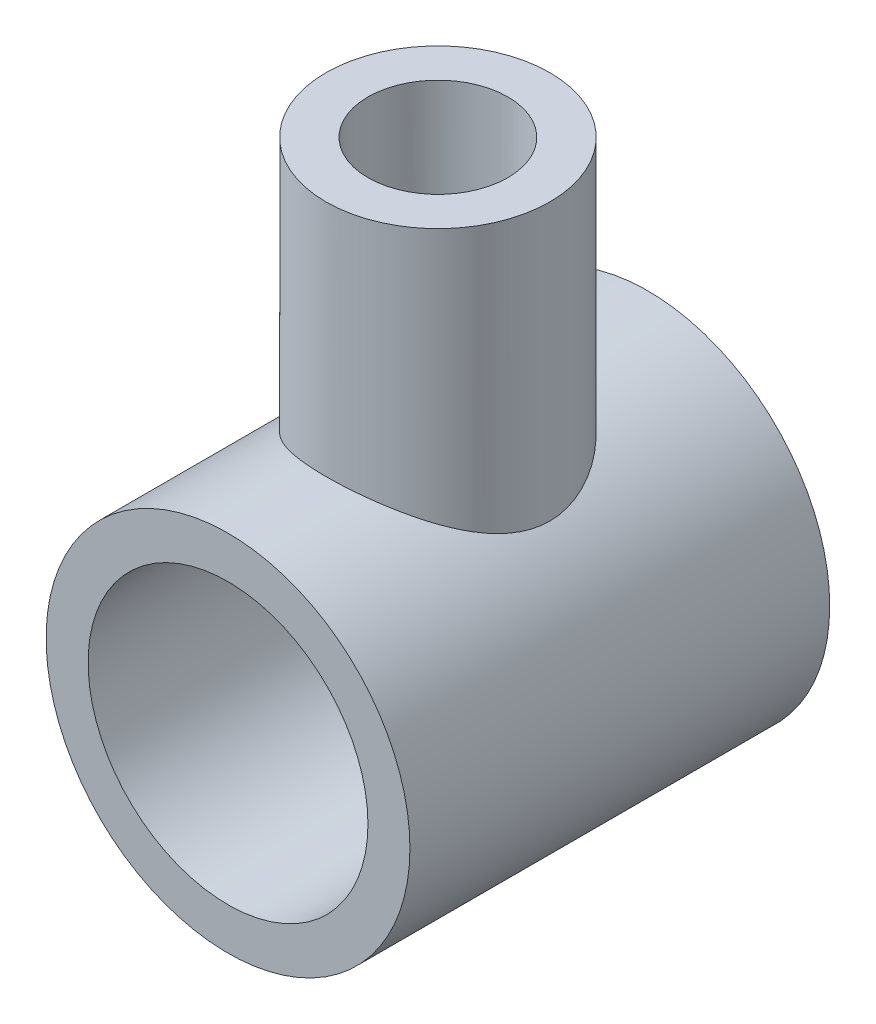
ISO-10303-21;
HEADER;
FILE_DESCRIPTION(('STEP AP214'),'2;1');
FILE_NAME('part.step','',(''),(''),'','','');
FILE_SCHEMA(('AUTOMOTIVE_DESIGN { 1 0 10303 214 1 1 1 1 }'));
ENDSEC;
DATA;
#1=APPLICATION_CONTEXT('core data for automotive mechanical design processes');
#2=APPLICATION_PROTOCOL_DEFINITION('international standard','automotive_design',2000,#1);
#3=PRODUCT_CONTEXT('',#1,'mechanical');
#4=PRODUCT('Part','Part','',(#3));
#5=PRODUCT_RELATED_PRODUCT_CATEGORY('part','',(#4));
#6=PRODUCT_DEFINITION_FORMATION('','',#4);
#7=PRODUCT_DEFINITION_CONTEXT('part definition',#1,'design');
#8=PRODUCT_DEFINITION('design','',#6,#7);
#9=PRODUCT_DEFINITION_SHAPE('','',#8);
#10=(LENGTH_UNIT() NAMED_UNIT(*) SI_UNIT(.MILLI.,.METRE.));
#11=(NAMED_UNIT(*) PLANE_ANGLE_UNIT() SI_UNIT($,.RADIAN.));
#12=(NAMED_UNIT(*) SI_UNIT($,.STERADIAN.) SOLID_ANGLE_UNIT());
#13=UNCERTAINTY_MEASURE_WITH_UNIT(LENGTH_MEASURE(1.E-05),#10,'distance_accuracy_value','');
#14=(GEOMETRIC_REPRESENTATION_CONTEXT(3) GLOBAL_UNCERTAINTY_ASSIGNED_CONTEXT((#13)) GLOBAL_UNIT_ASSIGNED_CONTEXT((#10,
#11,#12)) REPRESENTATION_CONTEXT('',''));
#15=CARTESIAN_POINT('',(0.,0.,0.));
#16=DIRECTION('',(0.,0.,1.));
#17=DIRECTION('',(1.,0.,0.));
#18=AXIS2_PLACEMENT_3D('',#15,#16,#17);
#19=CARTESIAN_POINT('',(0.,0.,7.5));
#20=DIRECTION('',(0.,0.,-1.));
#21=DIRECTION('',(-1.,0.,0.));
#22=AXIS2_PLACEMENT_3D('',#19,#20,#21);
#23=CYLINDRICAL_SURFACE('',#22,6.5);
#24=CARTESIAN_POINT('',(0.,0.,7.5));
#25=DIRECTION('',(0.,0.,1.));
#26=DIRECTION('',(1.,0.,0.));
#27=AXIS2_PLACEMENT_3D('',#24,#25,#26);
#28=CIRCLE('',#27,6.5);
#29=CARTESIAN_POINT('',(6.5,0.,7.5));
#30=VERTEX_POINT('',#29);
#31=EDGE_CURVE('E95',#30,#30,#28,.T.);
#32=ORIENTED_EDGE('',*,*,#31,.F.);
#33=EDGE_LOOP('',(#32));
#34=FACE_BOUND('',#33,.T.);
#35=CARTESIAN_POINT('',(0.,0.,-7.5));
#36=DIRECTION('',(0.,0.,1.));
#37=DIRECTION('',(1.,0.,0.));
#38=AXIS2_PLACEMENT_3D('',#35,#36,#37);
#39=CIRCLE('',#38,6.5);
#40=CARTESIAN_POINT('',(6.5,0.,-7.5));
#41=VERTEX_POINT('',#40);
#42=EDGE_CURVE('E64',#41,#41,#39,.T.);
#43=ORIENTED_EDGE('',*,*,#42,.T.);
#44=EDGE_LOOP('',(#43));
#45=FACE_BOUND('',#44,.T.);
#46=CARTESIAN_POINT('',(0.,6.5,-4.));
#47=CARTESIAN_POINT('',(0.101932680708924,6.49999939964213,-3.99999936054963));
#48=CARTESIAN_POINT('',(0.203878806195381,6.49759642537344,-3.99609786942631));
#49=CARTESIAN_POINT('',(0.406993632933587,6.48804313805651,-3.98054521335563));
#50=CARTESIAN_POINT('',(0.508161926085145,6.4808904848725,-3.96889022830731));
#51=CARTESIAN_POINT('',(0.709064124798982,6.46199793989135,-3.93796507327085));
#52=CARTESIAN_POINT('',(0.808795470608417,6.45025071191937,-3.91868272407969));
#53=CARTESIAN_POINT('',(1.00595451754588,6.42246005549568,-3.87276659528458));
#54=CARTESIAN_POINT('',(1.10338121878899,6.40641479821663,-3.84612968613958));
#55=CARTESIAN_POINT('',(1.3901756243653,6.35255691803006,-3.75597365800007));
#56=CARTESIAN_POINT('',(1.57528943914544,6.30889954357547,-3.68201466933035));
#57=CARTESIAN_POINT('',(1.9297608314987,6.20967156345692,-3.50927329359543));
#58=CARTESIAN_POINT('',(2.09912096298402,6.15410289363898,-3.41049493977129));
#59=CARTESIAN_POINT('',(2.43246843462129,6.03051332664323,-3.18229876284998));
#60=CARTESIAN_POINT('',(2.59498758730544,5.96185703352483,-3.05108312176818));
#61=CARTESIAN_POINT('',(2.89713498384097,5.8210369182389,-2.76583959083216));
#62=CARTESIAN_POINT('',(3.03673248524909,5.74886855107056,-2.61178158311085));
#63=CARTESIAN_POINT('',(3.30759420144231,5.59793127347747,-2.26164235327239));
#64=CARTESIAN_POINT('',(3.43539596724616,5.51952937475281,-2.06270084680701));
#65=CARTESIAN_POINT('',(3.65533248103207,5.37641343948428,-1.64156301331829));
#66=CARTESIAN_POINT('',(3.74752666836251,5.31167667453346,-1.41940623405734));
#67=CARTESIAN_POINT('',(3.87326011357902,5.22037402772382,-1.01520799199979));
#68=CARTESIAN_POINT('',(3.91573102482445,5.18829771586181,-0.837196765886856));
#69=CARTESIAN_POINT('',(3.97594580589465,5.14230907440785,-0.474838694700604));
#70=CARTESIAN_POINT('',(3.99372294201895,5.12837230966469,-0.290500716669431));
#71=CARTESIAN_POINT('',(4.00349999950967,5.12074595895237,0.0797273819597645));
#72=CARTESIAN_POINT('',(3.99543930608618,5.1271039838178,0.265620130498587));
#73=CARTESIAN_POINT('',(3.9539427145923,5.15916479652257,0.632892845420153));
#74=CARTESIAN_POINT('',(3.92048692916261,5.18488274534039,0.814269159871376));
#75=CARTESIAN_POINT('',(3.8309220569634,5.25138392297175,1.16453570359254));
#76=CARTESIAN_POINT('',(3.77525049357088,5.29187495767105,1.33359652217066));
#77=CARTESIAN_POINT('',(3.6433876025842,5.38350835112645,1.66036553952951));
#78=CARTESIAN_POINT('',(3.56718892487423,5.43465452366339,1.81806964614393));
#79=CARTESIAN_POINT('',(3.38044121046793,5.55310061350775,2.14821803394951));
#80=CARTESIAN_POINT('',(3.26616229358154,5.62164554875382,2.31810749469084));
#81=CARTESIAN_POINT('',(3.01364072965568,5.76097603548284,2.63810821445726));
#82=CARTESIAN_POINT('',(2.87537404935876,5.83176377532338,2.78819936958065));
#83=CARTESIAN_POINT('',(2.55329170194669,5.98052624344214,3.08807066690005));
#84=CARTESIAN_POINT('',(2.36573847303971,6.05791793203029,3.23420825984126));
#85=CARTESIAN_POINT('',(2.06484625711296,6.16423657207204,3.42792749817984));
#86=CARTESIAN_POINT('',(1.96123424376933,6.19806179959712,3.48827546304857));
#87=CARTESIAN_POINT('',(1.74801657559779,6.26153122750258,3.59984547189651));
#88=CARTESIAN_POINT('',(1.63841467671495,6.2911780071572,3.651073150836));
#89=CARTESIAN_POINT('',(1.42038496451484,6.34384426018709,3.74107083484312));
#90=CARTESIAN_POINT('',(1.31225072735403,6.36714642141863,3.78038704486324));
#91=CARTESIAN_POINT('',(1.09213710130066,6.40856957345925,3.84974527247573));
#92=CARTESIAN_POINT('',(0.980159948019934,6.42669352131951,3.87979258391504));
#93=CARTESIAN_POINT('',(0.753361043832851,6.45720747876296,3.93013090994354));
#94=CARTESIAN_POINT('',(0.638541739819374,6.4696022514696,3.9504300295364));
#95=CARTESIAN_POINT('',(0.407084361860792,6.48827821016213,3.98094223870478));
#96=CARTESIAN_POINT('',(0.290446579402582,6.49456036591815,3.99115692818459));
#97=CARTESIAN_POINT('',(0.0734077308498798,6.50035751208076,4.00058205171948));
#98=CARTESIAN_POINT('',(-0.026914273703341,6.50071629233339,4.00116461159487));
#99=CARTESIAN_POINT('',(-0.227261420800575,6.49679865155265,3.99479653868362));
#100=CARTESIAN_POINT('',(-0.327286462827223,6.49252080844237,3.98784359471816));
#101=CARTESIAN_POINT('',(-0.526196329035192,6.47943228783149,3.9664990638418));
#102=CARTESIAN_POINT('',(-0.625081637761232,6.4706236151527,3.95211076694611));
#103=CARTESIAN_POINT('',(-0.821051746754855,6.44869131450073,3.91609730396782));
#104=CARTESIAN_POINT('',(-0.918135837974395,6.43556602383216,3.89446934922222));
#105=CARTESIAN_POINT('',(-1.19923146014627,6.39115694243494,3.82078889365652));
#106=CARTESIAN_POINT('',(-1.37996984617289,6.35434768700243,3.75916306614339));
#107=CARTESIAN_POINT('',(-1.72830568705178,6.268592669914,3.61231054813278));
#108=CARTESIAN_POINT('',(-1.89590079796368,6.2196447499267,3.52707966019108));
#109=CARTESIAN_POINT('',(-2.23192130281633,6.1076166997366,3.32576246940347));
#110=CARTESIAN_POINT('',(-2.39867686729207,6.04360299577601,3.20741128844292));
#111=CARTESIAN_POINT('',(-2.71116426769564,5.91003761054415,2.94803538380609));
#112=CARTESIAN_POINT('',(-2.856871799202,5.84047966877912,2.80698483981846));
#113=CARTESIAN_POINT('',(-3.14418734434135,5.69155065108857,2.48339259834901));
#114=CARTESIAN_POINT('',(-3.28237946774826,5.61216608195678,2.29780736292748));
#115=CARTESIAN_POINT('',(-3.52597700125825,5.4624121106953,1.90294046969936));
#116=CARTESIAN_POINT('',(-3.63141005068427,5.3920351383684,1.69367899238645));
#117=CARTESIAN_POINT('',(-3.78678713320714,5.28367733942729,1.30179947231776));
#118=CARTESIAN_POINT('',(-3.8437687122075,5.24198866192205,1.12301089134489));
#119=CARTESIAN_POINT('',(-3.93236674559127,5.17586702804936,0.756275579307613));
#120=CARTESIAN_POINT('',(-3.96402131570246,5.15140814846112,0.568343063270016));
#121=CARTESIAN_POINT('',(-4.00020927394428,5.12336832701716,0.187323288995591));
#122=CARTESIAN_POINT('',(-4.00460933438682,5.11989002324805,-0.00578467580314437));
#123=CARTESIAN_POINT('',(-3.9856031832953,5.13469450762807,-0.389821116612362));
#124=CARTESIAN_POINT('',(-3.96218493014542,5.15298671951048,-0.580748612641611));
#125=CARTESIAN_POINT('',(-3.89159080354568,5.20646438912713,-0.94186813503688));
#126=CARTESIAN_POINT('',(-3.84612501709333,5.24042638998554,-1.11258993932448));
#127=CARTESIAN_POINT('',(-3.73437644692224,5.32063404638092,-1.44396977671976));
#128=CARTESIAN_POINT('',(-3.66808545804421,5.3668845424927,-1.6046238131347));
#129=CARTESIAN_POINT('',(-3.50525660774396,5.47485593522413,-1.93710246986113));
#130=CARTESIAN_POINT('',(-3.40568219493729,5.53785535379418,-2.10701959386876));
#131=CARTESIAN_POINT('',(-3.18377799217514,5.66834893374762,-2.42939028249622));
#132=CARTESIAN_POINT('',(-3.06142942967632,5.73584677346185,-2.58182927130094));
#133=CARTESIAN_POINT('',(-2.77088545228835,5.88245015568858,-2.89406092396147));
#134=CARTESIAN_POINT('',(-2.59839586958272,5.96139567713425,-3.05000658550481));
#135=CARTESIAN_POINT('',(-2.31959905762348,6.07285442111121,-3.26084129505035));
#136=CARTESIAN_POINT('',(-2.22322905085715,6.10887614027553,-3.32732071469118));
#137=CARTESIAN_POINT('',(-2.02420708613854,6.17767285816209,-3.4520071488549));
#138=CARTESIAN_POINT('',(-1.92155856623495,6.21044960849657,-3.51021863381084));
#139=CARTESIAN_POINT('',(-1.71168075911792,6.27152032206102,-3.61716332822728));
#140=CARTESIAN_POINT('',(-1.60451420044738,6.29985958574469,-3.66599365876974));
#141=CARTESIAN_POINT('',(-1.38531879033559,6.35165805839771,-3.75430948185009));
#142=CARTESIAN_POINT('',(-1.27329281083248,6.37512010358107,-3.79380040731539));
#143=CARTESIAN_POINT('',(-1.04553758026327,6.41640153061193,-3.86276708236209));
#144=CARTESIAN_POINT('',(-0.929819668120429,6.43423664431957,-3.89227077158387));
#145=CARTESIAN_POINT('',(-0.695517286704315,6.46375854143765,-3.94088183817186));
#146=CARTESIAN_POINT('',(-0.576935114015966,6.47545009014327,-3.95999727364797));
#147=CARTESIAN_POINT('',(-0.381732098443042,6.48922704389009,-3.98247549486234));
#148=CARTESIAN_POINT('',(-0.305599131290928,6.49326122029153,-3.98904157133006));
#149=CARTESIAN_POINT('',(-0.152979979894234,6.49864800040319,-3.99780418896192));
#150=CARTESIAN_POINT('',(-0.0764937756709483,6.50000045052911,-4.00000047986547));
#151=CARTESIAN_POINT('',(0.,6.5,-4.));
#152=B_SPLINE_CURVE_WITH_KNOTS('',3,(#46,#47,#48,#49,#50,#51,#52,#53,#54,#55,#56,#57,#58,#59,
#60,#61,#62,#63,#64,#65,#66,#67,#68,#69,#70,#71,#72,#73,#74,#75,#76,#77,#78,#79,#80,#81,#82,#83,
#84,#85,#86,#87,#88,#89,#90,#91,#92,#93,#94,#95,#96,#97,#98,#99,#100,#101,#102,#103,#104,#105,
#106,#107,#108,#109,#110,#111,#112,#113,#114,#115,#116,#117,#118,#119,#120,#121,#122,#123,#124,
#125,#126,#127,#128,#129,#130,#131,#132,#133,#134,#135,#136,#137,#138,#139,#140,#141,#142,#143,
#144,#145,#146,#147,#148,#149,#150,#151),.UNSPECIFIED.,.T.,.F.,(4,2,2,2,2,2,2,2,2,2,2,2,2,2,2,2,
2,2,2,2,2,2,2,2,2,2,2,2,2,2,2,2,2,2,2,2,2,2,2,2,2,2,2,2,2,2,2,2,2,2,2,2,4),(0.,
0.305718619840286,0.61158797711635,0.917947724116181,1.22443803595933,1.83370758844798,
2.44287819628248,3.09992173034146,3.75783941554365,4.50157971065203,5.24407306607348,
5.79913351601445,6.35344548688587,6.90905880826945,7.46510769004447,8.01070711549895,
8.55650216326685,9.20180749233863,9.84776312419874,10.5936818084878,10.9669982233067,
11.3400831783566,11.6917577434105,12.0432310792623,12.3944116791819,12.7455365550122,
13.0461288493385,13.346813363006,13.6473649427503,13.9480324262314,14.5287938859811,
15.1096586829247,15.7499604595229,16.3909957894115,17.1215772639591,17.851540651547,
18.4258989337247,18.9993912044513,19.5756867690036,20.1522318835253,20.689865595597,
21.2277114023502,21.8457728687646,22.4643460724999,23.1972317489622,23.5643235343845,
23.9312160731969,24.2940771063543,24.6567265335618,25.0183528860118,25.379698325088,
25.6091069128882,25.8385286386964),.UNSPECIFIED.);
#153=CARTESIAN_POINT('',(0.,6.5,-4.));
#154=VERTEX_POINT('',#153);
#155=EDGE_CURVE('E10',#154,#154,#152,.T.);
#156=ORIENTED_EDGE('',*,*,#155,.T.);
#157=EDGE_LOOP('',(#156));
#158=FACE_BOUND('',#157,.T.);
#159=ADVANCED_FACE('F37',(#34,#45,#158),#23,.T.);
#160=CARTESIAN_POINT('',(0.,0.,7.5));
#161=DIRECTION('',(0.,0.,1.));
#162=DIRECTION('',(1.,0.,0.));
#163=AXIS2_PLACEMENT_3D('',#160,#161,#162);
#164=PLANE('',#163);
#165=CARTESIAN_POINT('',(0.,0.,7.5));
#166=DIRECTION('',(0.,0.,1.));
#167=DIRECTION('',(1.,0.,0.));
#168=AXIS2_PLACEMENT_3D('',#165,#166,#167);
#169=CIRCLE('',#168,5.);
#170=CARTESIAN_POINT('',(5.,0.,7.5));
#171=VERTEX_POINT('',#170);
#172=EDGE_CURVE('E104',#171,#171,#169,.T.);
#173=ORIENTED_EDGE('',*,*,#172,.F.);
#174=EDGE_LOOP('',(#173));
#175=FACE_BOUND('',#174,.T.);
#176=ORIENTED_EDGE('',*,*,#31,.T.);
#177=EDGE_LOOP('',(#176));
#178=FACE_BOUND('',#177,.T.);
#179=ADVANCED_FACE('F86',(#175,#178),#164,.T.);
#180=CARTESIAN_POINT('',(0.,0.,-7.5));
#181=DIRECTION('',(0.,0.,1.));
#182=DIRECTION('',(1.,0.,0.));
#183=AXIS2_PLACEMENT_3D('',#180,#181,#182);
#184=PLANE('',#183);
#185=CARTESIAN_POINT('',(0.,0.,-7.5));
#186=DIRECTION('',(0.,0.,1.));
#187=DIRECTION('',(1.,0.,0.));
#188=AXIS2_PLACEMENT_3D('',#185,#186,#187);
#189=CIRCLE('',#188,5.);
#190=CARTESIAN_POINT('',(5.,0.,-7.5));
#191=VERTEX_POINT('',#190);
#192=EDGE_CURVE('E100',#191,#191,#189,.F.);
#193=ORIENTED_EDGE('',*,*,#192,.F.);
#194=EDGE_LOOP('',(#193));
#195=FACE_BOUND('',#194,.T.);
#196=ORIENTED_EDGE('',*,*,#42,.F.);
#197=EDGE_LOOP('',(#196));
#198=FACE_BOUND('',#197,.T.);
#199=ADVANCED_FACE('F73',(#195,#198),#184,.F.);
#200=CARTESIAN_POINT('',(0.,15.,0.));
#201=DIRECTION('',(0.,-1.,0.));
#202=DIRECTION('',(0.,0.,-1.));
#203=AXIS2_PLACEMENT_3D('',#200,#201,#202);
#204=CYLINDRICAL_SURFACE('',#203,4.);
#205=CARTESIAN_POINT('',(0.,15.,0.));
#206=DIRECTION('',(0.,1.,0.));
#207=DIRECTION('',(0.,0.,1.));
#208=AXIS2_PLACEMENT_3D('',#205,#206,#207);
#209=CIRCLE('',#208,4.);
#210=CARTESIAN_POINT('',(0.,15.,4.));
#211=VERTEX_POINT('',#210);
#212=EDGE_CURVE('E52',#211,#211,#209,.T.);
#213=ORIENTED_EDGE('',*,*,#212,.F.);
#214=EDGE_LOOP('',(#213));
#215=FACE_BOUND('',#214,.T.);
#216=ORIENTED_EDGE('',*,*,#155,.F.);
#217=EDGE_LOOP('',(#216));
#218=FACE_BOUND('',#217,.T.);
#219=ADVANCED_FACE('F39',(#215,#218),#204,.T.);
#220=CARTESIAN_POINT('',(0.,15.,0.));
#221=DIRECTION('',(0.,-1.,0.));
#222=DIRECTION('',(0.,0.,-1.));
#223=AXIS2_PLACEMENT_3D('',#220,#221,#222);
#224=CYLINDRICAL_SURFACE('',#223,2.5);
#225=CARTESIAN_POINT('',(0.,15.,0.));
#226=DIRECTION('',(0.,1.,0.));
#227=DIRECTION('',(0.,0.,1.));
#228=AXIS2_PLACEMENT_3D('',#225,#226,#227);
#229=CIRCLE('',#228,2.5);
#230=CARTESIAN_POINT('',(0.,15.,2.5));
#231=VERTEX_POINT('',#230);
#232=EDGE_CURVE('E58',#231,#231,#229,.T.);
#233=ORIENTED_EDGE('',*,*,#232,.T.);
#234=EDGE_LOOP('',(#233));
#235=FACE_BOUND('',#234,.T.);
#236=CARTESIAN_POINT('',(0.,6.5,-2.5));
#237=CARTESIAN_POINT('',(0.13514306397447,6.500004629863,-2.50000607263442));
#238=CARTESIAN_POINT('',(0.270245683690178,6.49574921829708,-2.4890079896678));
#239=CARTESIAN_POINT('',(0.536399893676355,6.47920060501405,-2.44549532030769));
#240=CARTESIAN_POINT('',(0.667452289329331,6.46690901219325,-2.4129850407816));
#241=CARTESIAN_POINT('',(0.9216280032252,6.43560329326637,-2.32777690684249));
#242=CARTESIAN_POINT('',(1.04476653465277,6.41660255099367,-2.27511922637949));
#243=CARTESIAN_POINT('',(1.28044908901321,6.3737599269311,-2.15132091327757));
#244=CARTESIAN_POINT('',(1.39299010958969,6.34991667922571,-2.08017506413297));
#245=CARTESIAN_POINT('',(1.60927258674544,6.29865787982818,-1.9181304284963));
#246=CARTESIAN_POINT('',(1.71248272971103,6.27113765392606,-1.82655593833618));
#247=CARTESIAN_POINT('',(1.90251373412529,6.21612788263757,-1.62768791119207));
#248=CARTESIAN_POINT('',(1.98932919333357,6.18863835032093,-1.52038921350983));
#249=CARTESIAN_POINT('',(2.14757341678641,6.13556746669898,-1.28782502081142));
#250=CARTESIAN_POINT('',(2.21823663101441,6.11010848455125,-1.1620078714067));
#251=CARTESIAN_POINT('',(2.33716189177337,6.06561918541038,-0.899143340178054));
#252=CARTESIAN_POINT('',(2.38543341568332,6.04658614953798,-0.762100738525679));
#253=CARTESIAN_POINT('',(2.45608262902037,6.01822730812514,-0.486803263774012));
#254=CARTESIAN_POINT('',(2.47947801200992,6.00852169181304,-0.348850046692211));
#255=CARTESIAN_POINT('',(2.50289199475193,5.99880894830526,-0.0706605400230444));
#256=CARTESIAN_POINT('',(2.50292090442516,5.99879754376073,0.0695747153534131));
#257=CARTESIAN_POINT('',(2.48037656312943,6.00814837573631,0.338864258151772));
#258=CARTESIAN_POINT('',(2.45923795706445,6.01691562933088,0.468063212914782));
#259=CARTESIAN_POINT('',(2.39733806133434,6.04184340382831,0.720915079406598));
#260=CARTESIAN_POINT('',(2.35657365742926,6.05800509806771,0.844567107538577));
#261=CARTESIAN_POINT('',(2.25582663922901,6.09624370169108,1.08565831178227));
#262=CARTESIAN_POINT('',(2.19548450476653,6.1184298919496,1.20292915221691));
#263=CARTESIAN_POINT('',(2.05754611602823,6.16618367671209,1.4260878785016));
#264=CARTESIAN_POINT('',(1.97994369235949,6.19175247894498,1.53197167412292));
#265=CARTESIAN_POINT('',(1.80320515332933,6.24560345180462,1.73725916124574));
#266=CARTESIAN_POINT('',(1.70293144449403,6.27394938839792,1.83566921960999));
#267=CARTESIAN_POINT('',(1.48698639045577,6.32860686825818,2.01458066928345));
#268=CARTESIAN_POINT('',(1.37131243202998,6.35491806505566,2.09507901500064));
#269=CARTESIAN_POINT('',(1.12520910755081,6.4031140673231,2.23705504821493));
#270=CARTESIAN_POINT('',(0.994562099156595,6.42491590699446,2.29818565759317));
#271=CARTESIAN_POINT('',(0.723789666413505,6.46101701436,2.39726610254889));
#272=CARTESIAN_POINT('',(0.583668713964964,6.47531979423949,2.43522679113062));
#273=CARTESIAN_POINT('',(0.306275874042356,6.49418523125042,2.48494218176227));
#274=CARTESIAN_POINT('',(0.169277177253719,6.49924422048434,2.49803387895837));
#275=CARTESIAN_POINT('',(-0.105038056069672,6.50059706095232,2.50155343803674));
#276=CARTESIAN_POINT('',(-0.242354510117282,6.49689297696438,2.49198663877198));
#277=CARTESIAN_POINT('',(-0.50752339148459,6.4814625265296,2.45146491565983));
#278=CARTESIAN_POINT('',(-0.635533278632625,6.47007006377642,2.42139969396868));
#279=CARTESIAN_POINT('',(-0.884591112419542,6.44074795216429,2.34192076949868));
#280=CARTESIAN_POINT('',(-1.0056381538334,6.42281745552311,2.29250455742913));
#281=CARTESIAN_POINT('',(-1.24139762727352,6.38151162872812,2.17413238476666));
#282=CARTESIAN_POINT('',(-1.35581229097729,6.35798948099243,2.10463618562237));
#283=CARTESIAN_POINT('',(-1.57174720946057,6.30808313000719,1.94868287187253));
#284=CARTESIAN_POINT('',(-1.67326251243974,6.28169783481671,1.86221927604329));
#285=CARTESIAN_POINT('',(-1.86700866345895,6.22695982329862,1.66858024931667));
#286=CARTESIAN_POINT('',(-1.95829399903938,6.19858535620119,1.56046246103081));
#287=CARTESIAN_POINT('',(-2.12162980756564,6.14459987855306,1.32990459735798));
#288=CARTESIAN_POINT('',(-2.19367804771028,6.11898918899244,1.20746286179642));
#289=CARTESIAN_POINT('',(-2.31670165885943,6.07348698871133,0.950423952602979));
#290=CARTESIAN_POINT('',(-2.3675457507259,6.05363133271636,0.815757160765263));
#291=CARTESIAN_POINT('',(-2.44547862786552,6.02257652756719,0.538789394496574));
#292=CARTESIAN_POINT('',(-2.47258316364823,6.01137163946424,0.396493548339967));
#293=CARTESIAN_POINT('',(-2.50082210532946,5.99967502686126,0.118611399131824));
#294=CARTESIAN_POINT('',(-2.50357962943263,5.99851384313484,-0.0167830190696173));
#295=CARTESIAN_POINT('',(-2.48724412852084,6.00530547478505,-0.286001092434689));
#296=CARTESIAN_POINT('',(-2.4681534084365,6.01325732876099,-0.419824911787674));
#297=CARTESIAN_POINT('',(-2.40995136741685,6.03680892276013,-0.677496062802731));
#298=CARTESIAN_POINT('',(-2.37153828396777,6.05214118297217,-0.801527702311891));
#299=CARTESIAN_POINT('',(-2.27641115159598,6.08855756315716,-1.04144979345927));
#300=CARTESIAN_POINT('',(-2.21969236739862,6.1096431711739,-1.15733812915161));
#301=CARTESIAN_POINT('',(-2.08599319505102,6.15661478314378,-1.38453530357425));
#302=CARTESIAN_POINT('',(-2.00807939428015,6.18269935662047,-1.49525324147573));
#303=CARTESIAN_POINT('',(-1.83561573990325,6.23607706100414,-1.70255971790903));
#304=CARTESIAN_POINT('',(-1.74106046198838,6.2633705837922,-1.79914363058137));
#305=CARTESIAN_POINT('',(-1.53143830219016,6.31799605166972,-1.98117537596898));
#306=CARTESIAN_POINT('',(-1.41549882935315,6.34523808084889,-2.06565005893958));
#307=CARTESIAN_POINT('',(-1.17010716237063,6.39503827616325,-2.2139108596428));
#308=CARTESIAN_POINT('',(-1.04065270472818,6.41759565581366,-2.27769350449073));
#309=CARTESIAN_POINT('',(-0.762900842232431,6.4566913943766,-2.38570441901872));
#310=CARTESIAN_POINT('',(-0.613925037531385,6.47274070554298,-2.42838437605498));
#311=CARTESIAN_POINT('',(-0.309946097844235,6.49438936244195,-2.48552060492461));
#312=CARTESIAN_POINT('',(-0.154946466000344,6.49999469169273,-2.49999303750252));
#313=CARTESIAN_POINT('',(0.,6.5,-2.5));
#314=B_SPLINE_CURVE_WITH_KNOTS('',3,(#236,#237,#238,#239,#240,#241,#242,#243,#244,#245,#246,
#247,#248,#249,#250,#251,#252,#253,#254,#255,#256,#257,#258,#259,#260,#261,#262,#263,#264,#265,
#266,#267,#268,#269,#270,#271,#272,#273,#274,#275,#276,#277,#278,#279,#280,#281,#282,#283,#284,
#285,#286,#287,#288,#289,#290,#291,#292,#293,#294,#295,#296,#297,#298,#299,#300,#301,#302,#303,
#304,#305,#306,#307,#308,#309,#310,#311,#312,#313),.UNSPECIFIED.,.T.,.F.,(4,2,2,2,2,2,2,2,2,2,2,
2,2,2,2,2,2,2,2,2,2,2,2,2,2,2,2,2,2,2,2,2,2,2,2,2,2,2,4),(0.,0.404857395673178,
0.809633761045268,1.21360717298344,1.61769469151936,2.03792903302866,2.45830160597868,
2.89569907712733,3.33291124861789,3.75145366078395,4.16981140060331,4.56161223088491,
4.95347525299002,5.35298551114875,5.75263879750163,6.18066348321893,6.60876089197114,
7.04414506400744,7.47932514126757,7.89036278979613,8.30130359821626,8.6954568641467,
9.08966125783838,9.49565660960561,9.90180734683235,10.3327599285419,10.7637625081092,
11.1973952581665,11.6307400870075,12.0349578310579,12.4391329351611,12.8296520191847,
13.2202722028207,13.6321153154032,14.0440929181879,14.4800085178991,14.9159972424678,
15.3804472276237,15.8446310403091),.UNSPECIFIED.);
#315=CARTESIAN_POINT('',(0.,6.5,-2.5));
#316=VERTEX_POINT('',#315);
#317=EDGE_CURVE('E42',#316,#316,#314,.T.);
#318=ORIENTED_EDGE('',*,*,#317,.T.);
#319=EDGE_LOOP('',(#318));
#320=FACE_BOUND('',#319,.T.);
#321=ADVANCED_FACE('F75',(#235,#320),#224,.F.);
#322=CARTESIAN_POINT('',(0.,15.,0.));
#323=DIRECTION('',(0.,1.,0.));
#324=DIRECTION('',(0.,0.,1.));
#325=AXIS2_PLACEMENT_3D('',#322,#323,#324);
#326=PLANE('',#325);
#327=ORIENTED_EDGE('',*,*,#212,.T.);
#328=EDGE_LOOP('',(#327));
#329=FACE_BOUND('',#328,.T.);
#330=ORIENTED_EDGE('',*,*,#232,.F.);
#331=EDGE_LOOP('',(#330));
#332=FACE_BOUND('',#331,.T.);
#333=ADVANCED_FACE('F71',(#329,#332),#326,.T.);
#334=ORIENTED_EDGE('',*,*,#317,.F.);
#335=EDGE_LOOP('',(#334));
#336=FACE_BOUND('',#335,.T.);
#337=ADVANCED_FACE('F66',(#336),#23,.T.);
#338=CARTESIAN_POINT('',(0.,0.,-21.6421356237309));
#339=DIRECTION('',(0.,0.,1.));
#340=DIRECTION('',(1.,0.,0.));
#341=AXIS2_PLACEMENT_3D('',#338,#339,#340);
#342=CYLINDRICAL_SURFACE('',#341,5.);
#343=CARTESIAN_POINT('',(5.,0.,-7.5));
#344=CARTESIAN_POINT('',(5.,0.,-7.34375));
#345=CARTESIAN_POINT('',(5.,0.,-7.1875));
#346=CARTESIAN_POINT('',(5.,0.,-6.875));
#347=CARTESIAN_POINT('',(5.,0.,-6.71875));
#348=CARTESIAN_POINT('',(5.,0.,-6.40625));
#349=CARTESIAN_POINT('',(5.,0.,-6.25));
#350=CARTESIAN_POINT('',(5.,0.,-5.9375));
#351=CARTESIAN_POINT('',(5.,0.,-5.78125));
#352=CARTESIAN_POINT('',(5.,0.,-5.46875));
#353=CARTESIAN_POINT('',(5.,0.,-5.3125));
#354=CARTESIAN_POINT('',(5.,0.,-5.));
#355=CARTESIAN_POINT('',(5.,0.,-4.84375));
#356=CARTESIAN_POINT('',(5.,0.,-4.53125));
#357=CARTESIAN_POINT('',(5.,0.,-4.375));
#358=CARTESIAN_POINT('',(5.,0.,-4.0625));
#359=CARTESIAN_POINT('',(5.,0.,-3.90625));
#360=CARTESIAN_POINT('',(5.,0.,-3.59375));
#361=CARTESIAN_POINT('',(5.,0.,-3.4375));
#362=CARTESIAN_POINT('',(5.,0.,-3.125));
#363=CARTESIAN_POINT('',(5.,0.,-2.96875));
#364=CARTESIAN_POINT('',(5.,0.,-2.65625));
#365=CARTESIAN_POINT('',(5.,0.,-2.5));
#366=CARTESIAN_POINT('',(5.,0.,-2.1875));
#367=CARTESIAN_POINT('',(5.,0.,-2.03125));
#368=CARTESIAN_POINT('',(5.,0.,-1.71875));
#369=CARTESIAN_POINT('',(5.,0.,-1.5625));
#370=CARTESIAN_POINT('',(5.,0.,-1.25));
#371=CARTESIAN_POINT('',(5.,0.,-1.09375));
#372=CARTESIAN_POINT('',(5.,0.,-0.781250000000004));
#373=CARTESIAN_POINT('',(5.,0.,-0.625000000000004));
#374=CARTESIAN_POINT('',(5.,0.,-0.312500000000004));
#375=CARTESIAN_POINT('',(5.,0.,-0.156250000000004));
#376=CARTESIAN_POINT('',(5.,0.,0.156249999999997));
#377=CARTESIAN_POINT('',(5.,0.,0.312499999999997));
#378=CARTESIAN_POINT('',(5.,0.,0.624999999999997));
#379=CARTESIAN_POINT('',(5.,0.,0.781249999999997));
#380=CARTESIAN_POINT('',(5.,0.,1.09375));
#381=CARTESIAN_POINT('',(5.,0.,1.25));
#382=CARTESIAN_POINT('',(5.,0.,1.5625));
#383=CARTESIAN_POINT('',(5.,0.,1.71875));
#384=CARTESIAN_POINT('',(5.,0.,2.03125));
#385=CARTESIAN_POINT('',(5.,0.,2.1875));
#386=CARTESIAN_POINT('',(5.,0.,2.5));
#387=CARTESIAN_POINT('',(5.,0.,2.65625));
#388=CARTESIAN_POINT('',(5.,0.,2.96875));
#389=CARTESIAN_POINT('',(5.,0.,3.125));
#390=CARTESIAN_POINT('',(5.,0.,3.4375));
#391=CARTESIAN_POINT('',(5.,0.,3.59375));
#392=CARTESIAN_POINT('',(5.,0.,3.90625));
#393=CARTESIAN_POINT('',(5.,0.,4.0625));
#394=CARTESIAN_POINT('',(5.,0.,4.375));
#395=CARTESIAN_POINT('',(5.,0.,4.53125));
#396=CARTESIAN_POINT('',(5.,0.,4.84375));
#397=CARTESIAN_POINT('',(5.,0.,5.));
#398=CARTESIAN_POINT('',(5.,0.,5.3125));
#399=CARTESIAN_POINT('',(5.,0.,5.46875));
#400=CARTESIAN_POINT('',(5.,0.,5.78125));
#401=CARTESIAN_POINT('',(5.,0.,5.9375));
#402=CARTESIAN_POINT('',(5.,0.,6.25));
#403=CARTESIAN_POINT('',(5.,0.,6.40625));
#404=CARTESIAN_POINT('',(5.,0.,6.71875));
#405=CARTESIAN_POINT('',(5.,0.,6.875));
#406=CARTESIAN_POINT('',(5.,0.,7.1875));
#407=CARTESIAN_POINT('',(5.,0.,7.34375));
#408=CARTESIAN_POINT('',(5.,0.,7.5));
#409=B_SPLINE_CURVE_WITH_KNOTS('',3,(#343,#344,#345,#346,#347,#348,#349,#350,#351,#352,#353,
#354,#355,#356,#357,#358,#359,#360,#361,#362,#363,#364,#365,#366,#367,#368,#369,#370,#371,#372,
#373,#374,#375,#376,#377,#378,#379,#380,#381,#382,#383,#384,#385,#386,#387,#388,#389,#390,#391,
#392,#393,#394,#395,#396,#397,#398,#399,#400,#401,#402,#403,#404,#405,#406,#407,#408),
.UNSPECIFIED.,.F.,.F.,(4,2,2,2,2,2,2,2,2,2,2,2,2,2,2,2,2,2,2,2,2,2,2,2,2,2,2,2,2,2,2,2,4),(0.,
0.46875,0.937500000000001,1.40625,1.875,2.34375,2.8125,3.28125,3.75,4.21875,4.6875,5.15625,
5.625,6.09375,6.5625,7.03125,7.5,7.96875,8.4375,8.90625,9.375,9.84375,10.3125,10.78125,11.25,
11.71875,12.1875,12.65625,13.125,13.59375,14.0625,14.53125,15.),.UNSPECIFIED.);
#410=EDGE_CURVE('BSEAM70',#191,#171,#409,.T.);
#411=ORIENTED_EDGE('',*,*,#192,.T.);
#412=ORIENTED_EDGE('',*,*,#172,.T.);
#413=ORIENTED_EDGE('',*,*,#410,.T.);
#414=ORIENTED_EDGE('',*,*,#410,.F.);
#415=EDGE_LOOP('',(#411,#413,#412,#414));
#416=FACE_BOUND('',#415,.T.);
#417=ADVANCED_FACE('F70',(#416),#342,.F.);
#418=CLOSED_SHELL('',(#159,#179,#199,#219,#321,#333,#337,#417));
#419=MANIFOLD_SOLID_BREP('B2',#418);
#420=ADVANCED_BREP_SHAPE_REPRESENTATION('',(#18,#419),#14);
#421=SHAPE_DEFINITION_REPRESENTATION(#9,#420);
ENDSEC;
END-ISO-10303-21;
